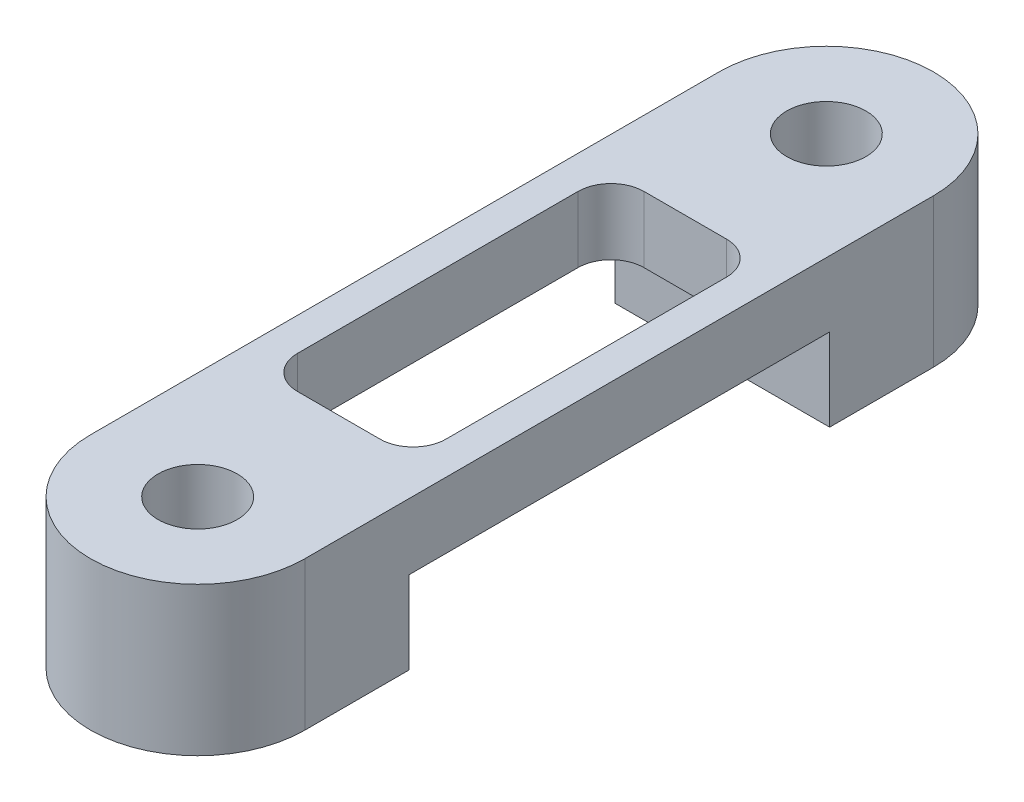
ISO-10303-21;
HEADER;
FILE_DESCRIPTION(('STEP AP214'),'2;1');
FILE_NAME('part.step','',(''),(''),'','','');
FILE_SCHEMA(('AUTOMOTIVE_DESIGN { 1 0 10303 214 1 1 1 1 }'));
ENDSEC;
DATA;
#1=APPLICATION_CONTEXT('core data for automotive mechanical design processes');
#2=APPLICATION_PROTOCOL_DEFINITION('international standard','automotive_design',2000,#1);
#3=PRODUCT_CONTEXT('',#1,'mechanical');
#4=PRODUCT('Part','Part','',(#3));
#5=PRODUCT_RELATED_PRODUCT_CATEGORY('part','',(#4));
#6=PRODUCT_DEFINITION_FORMATION('','',#4);
#7=PRODUCT_DEFINITION_CONTEXT('part definition',#1,'design');
#8=PRODUCT_DEFINITION('design','',#6,#7);
#9=PRODUCT_DEFINITION_SHAPE('','',#8);
#10=(LENGTH_UNIT() NAMED_UNIT(*) SI_UNIT(.MILLI.,.METRE.));
#11=(NAMED_UNIT(*) PLANE_ANGLE_UNIT() SI_UNIT($,.RADIAN.));
#12=(NAMED_UNIT(*) SI_UNIT($,.STERADIAN.) SOLID_ANGLE_UNIT());
#13=UNCERTAINTY_MEASURE_WITH_UNIT(LENGTH_MEASURE(1.E-05),#10,'distance_accuracy_value','');
#14=(GEOMETRIC_REPRESENTATION_CONTEXT(3) GLOBAL_UNCERTAINTY_ASSIGNED_CONTEXT((#13)) GLOBAL_UNIT_ASSIGNED_CONTEXT((#10,
#11,#12)) REPRESENTATION_CONTEXT('',''));
#15=CARTESIAN_POINT('',(0.,0.,0.));
#16=DIRECTION('',(0.,0.,1.));
#17=DIRECTION('',(1.,0.,0.));
#18=AXIS2_PLACEMENT_3D('',#15,#16,#17);
#19=CARTESIAN_POINT('',(0.,-4.5,-9.525));
#20=DIRECTION('',(0.,1.,0.));
#21=DIRECTION('',(0.,0.,1.));
#22=AXIS2_PLACEMENT_3D('',#19,#20,#21);
#23=PLANE('',#22);
#24=DIRECTION('',(-1.,0.,0.));
#25=VECTOR('',#24,1.);
#26=CARTESIAN_POINT('',(0.,-4.5,-6.375));
#27=LINE('',#26,#25);
#28=CARTESIAN_POINT('',(3.24999999999999,-4.5,-6.375));
#29=VERTEX_POINT('',#28);
#30=CARTESIAN_POINT('',(-3.24999999999999,-4.5,-6.375));
#31=VERTEX_POINT('',#30);
#32=EDGE_CURVE('E200',#29,#31,#27,.T.);
#33=ORIENTED_EDGE('',*,*,#32,.T.);
#34=DIRECTION('',(0.,0.,1.));
#35=VECTOR('',#34,1.);
#36=CARTESIAN_POINT('',(-3.24999999999999,-4.5,0.));
#37=LINE('',#36,#35);
#38=CARTESIAN_POINT('',(-3.24999999999999,-4.5,-9.525));
#39=VERTEX_POINT('',#38);
#40=EDGE_CURVE('E202',#39,#31,#37,.T.);
#41=ORIENTED_EDGE('',*,*,#40,.F.);
#42=CARTESIAN_POINT('',(0.,-4.5,-9.525));
#43=DIRECTION('',(0.,1.,0.));
#44=DIRECTION('',(0.,0.,1.));
#45=AXIS2_PLACEMENT_3D('',#42,#43,#44);
#46=CIRCLE('',#45,3.24999999999999);
#47=CARTESIAN_POINT('',(3.24999999999999,-4.5,-9.525));
#48=VERTEX_POINT('',#47);
#49=EDGE_CURVE('E205',#48,#39,#46,.T.);
#50=ORIENTED_EDGE('',*,*,#49,.F.);
#51=DIRECTION('',(0.,0.,1.));
#52=VECTOR('',#51,1.);
#53=CARTESIAN_POINT('',(3.24999999999999,-4.5,0.));
#54=LINE('',#53,#52);
#55=EDGE_CURVE('E208',#48,#29,#54,.T.);
#56=ORIENTED_EDGE('',*,*,#55,.T.);
#57=EDGE_LOOP('',(#33,#41,#50,#56));
#58=FACE_BOUND('',#57,.T.);
#59=CARTESIAN_POINT('',(0.,-4.5,-9.525));
#60=DIRECTION('',(0.,-1.,0.));
#61=DIRECTION('',(0.,0.,-1.));
#62=AXIS2_PLACEMENT_3D('',#59,#60,#61);
#63=CIRCLE('',#62,1.2);
#64=CARTESIAN_POINT('',(0.,-4.5,-10.725));
#65=VERTEX_POINT('',#64);
#66=EDGE_CURVE('E397',#65,#65,#63,.T.);
#67=ORIENTED_EDGE('',*,*,#66,.F.);
#68=EDGE_LOOP('',(#67));
#69=FACE_BOUND('',#68,.T.);
#70=ADVANCED_FACE('F47',(#58,#69),#23,.F.);
#71=CARTESIAN_POINT('',(0.,-2.,0.));
#72=DIRECTION('',(0.,1.,0.));
#73=DIRECTION('',(0.,0.,1.));
#74=AXIS2_PLACEMENT_3D('',#71,#72,#73);
#75=PLANE('',#74);
#76=DIRECTION('',(-1.,0.,0.));
#77=VECTOR('',#76,1.);
#78=CARTESIAN_POINT('',(0.,-2.,-5.25));
#79=LINE('',#78,#77);
#80=CARTESIAN_POINT('',(1.24999999999999,-2.,-5.25));
#81=VERTEX_POINT('',#80);
#82=CARTESIAN_POINT('',(-1.24999999999999,-2.,-5.25));
#83=VERTEX_POINT('',#82);
#84=EDGE_CURVE('E222',#81,#83,#79,.T.);
#85=ORIENTED_EDGE('',*,*,#84,.T.);
#86=CARTESIAN_POINT('',(-1.24999999999999,-2.,-4.25));
#87=DIRECTION('',(0.,1.,0.));
#88=DIRECTION('',(0.,0.,1.));
#89=AXIS2_PLACEMENT_3D('',#86,#87,#88);
#90=CIRCLE('',#89,1.);
#91=CARTESIAN_POINT('',(-2.24999999999999,-2.,-4.25));
#92=VERTEX_POINT('',#91);
#93=EDGE_CURVE('E13',#83,#92,#90,.T.);
#94=ORIENTED_EDGE('',*,*,#93,.T.);
#95=DIRECTION('',(0.,0.,1.));
#96=VECTOR('',#95,1.);
#97=CARTESIAN_POINT('',(-2.24999999999999,-2.,0.));
#98=LINE('',#97,#96);
#99=CARTESIAN_POINT('',(-2.24999999999999,-2.,4.25));
#100=VERTEX_POINT('',#99);
#101=EDGE_CURVE('E219',#92,#100,#98,.T.);
#102=ORIENTED_EDGE('',*,*,#101,.T.);
#103=CARTESIAN_POINT('',(-1.24999999999999,-2.,4.25));
#104=DIRECTION('',(0.,1.,0.));
#105=DIRECTION('',(0.,0.,1.));
#106=AXIS2_PLACEMENT_3D('',#103,#104,#105);
#107=CIRCLE('',#106,1.);
#108=CARTESIAN_POINT('',(-1.24999999999999,-2.,5.25));
#109=VERTEX_POINT('',#108);
#110=EDGE_CURVE('E280',#100,#109,#107,.T.);
#111=ORIENTED_EDGE('',*,*,#110,.T.);
#112=DIRECTION('',(-1.,0.,0.));
#113=VECTOR('',#112,1.);
#114=CARTESIAN_POINT('',(0.,-2.,5.25));
#115=LINE('',#114,#113);
#116=CARTESIAN_POINT('',(1.24999999999999,-2.,5.25));
#117=VERTEX_POINT('',#116);
#118=EDGE_CURVE('E228',#117,#109,#115,.T.);
#119=ORIENTED_EDGE('',*,*,#118,.F.);
#120=CARTESIAN_POINT('',(1.24999999999999,-2.,4.25));
#121=DIRECTION('',(0.,1.,0.));
#122=DIRECTION('',(0.,0.,1.));
#123=AXIS2_PLACEMENT_3D('',#120,#121,#122);
#124=CIRCLE('',#123,1.);
#125=CARTESIAN_POINT('',(2.24999999999999,-2.,4.25));
#126=VERTEX_POINT('',#125);
#127=EDGE_CURVE('E284',#117,#126,#124,.T.);
#128=ORIENTED_EDGE('',*,*,#127,.T.);
#129=DIRECTION('',(0.,0.,1.));
#130=VECTOR('',#129,1.);
#131=CARTESIAN_POINT('',(2.24999999999999,-2.,0.));
#132=LINE('',#131,#130);
#133=CARTESIAN_POINT('',(2.24999999999999,-2.,-4.25));
#134=VERTEX_POINT('',#133);
#135=EDGE_CURVE('E225',#134,#126,#132,.T.);
#136=ORIENTED_EDGE('',*,*,#135,.F.);
#137=CARTESIAN_POINT('',(1.24999999999999,-2.,-4.25));
#138=DIRECTION('',(0.,1.,0.));
#139=DIRECTION('',(0.,0.,1.));
#140=AXIS2_PLACEMENT_3D('',#137,#138,#139);
#141=CIRCLE('',#140,1.);
#142=EDGE_CURVE('E69',#134,#81,#141,.T.);
#143=ORIENTED_EDGE('',*,*,#142,.T.);
#144=EDGE_LOOP('',(#85,#94,#102,#111,#119,#128,#136,#143));
#145=FACE_BOUND('',#144,.T.);
#146=DIRECTION('',(0.,0.,1.));
#147=VECTOR('',#146,1.);
#148=CARTESIAN_POINT('',(3.24999999999999,-2.,0.));
#149=LINE('',#148,#147);
#150=CARTESIAN_POINT('',(3.24999999999999,-2.,-6.375));
#151=VERTEX_POINT('',#150);
#152=CARTESIAN_POINT('',(3.24999999999999,-2.,6.375));
#153=VERTEX_POINT('',#152);
#154=EDGE_CURVE('E231',#151,#153,#149,.T.);
#155=ORIENTED_EDGE('',*,*,#154,.T.);
#156=DIRECTION('',(-1.,0.,0.));
#157=VECTOR('',#156,1.);
#158=CARTESIAN_POINT('',(0.,-2.,6.375));
#159=LINE('',#158,#157);
#160=CARTESIAN_POINT('',(-3.24999999999999,-2.,6.375));
#161=VERTEX_POINT('',#160);
#162=EDGE_CURVE('E183',#153,#161,#159,.T.);
#163=ORIENTED_EDGE('',*,*,#162,.T.);
#164=DIRECTION('',(0.,0.,1.));
#165=VECTOR('',#164,1.);
#166=CARTESIAN_POINT('',(-3.24999999999999,-2.,0.));
#167=LINE('',#166,#165);
#168=CARTESIAN_POINT('',(-3.24999999999999,-2.,-6.375));
#169=VERTEX_POINT('',#168);
#170=EDGE_CURVE('E234',#169,#161,#167,.T.);
#171=ORIENTED_EDGE('',*,*,#170,.F.);
#172=DIRECTION('',(-1.,0.,0.));
#173=VECTOR('',#172,1.);
#174=CARTESIAN_POINT('',(0.,-2.,-6.375));
#175=LINE('',#174,#173);
#176=EDGE_CURVE('E199',#151,#169,#175,.T.);
#177=ORIENTED_EDGE('',*,*,#176,.F.);
#178=EDGE_LOOP('',(#155,#163,#171,#177));
#179=FACE_BOUND('',#178,.T.);
#180=ADVANCED_FACE('F299',(#145,#179),#75,.F.);
#181=CARTESIAN_POINT('',(3.24999999999999,-2.,0.));
#182=DIRECTION('',(-1.,0.,0.));
#183=DIRECTION('',(0.,0.,1.));
#184=AXIS2_PLACEMENT_3D('',#181,#182,#183);
#185=PLANE('',#184);
#186=DIRECTION('',(0.,0.,1.));
#187=VECTOR('',#186,1.);
#188=CARTESIAN_POINT('',(3.24999999999999,0.,0.));
#189=LINE('',#188,#187);
#190=CARTESIAN_POINT('',(3.24999999999999,0.,-9.525));
#191=VERTEX_POINT('',#190);
#192=CARTESIAN_POINT('',(3.24999999999999,0.,9.525));
#193=VERTEX_POINT('',#192);
#194=EDGE_CURVE('E167',#191,#193,#189,.T.);
#195=ORIENTED_EDGE('',*,*,#194,.T.);
#196=DIRECTION('',(0.,1.,0.));
#197=VECTOR('',#196,1.);
#198=CARTESIAN_POINT('',(3.24999999999999,-2.,9.525));
#199=LINE('',#198,#197);
#200=CARTESIAN_POINT('',(3.24999999999999,-4.5,9.525));
#201=VERTEX_POINT('',#200);
#202=EDGE_CURVE('E161',#201,#193,#199,.T.);
#203=ORIENTED_EDGE('',*,*,#202,.F.);
#204=DIRECTION('',(0.,0.,1.));
#205=VECTOR('',#204,1.);
#206=CARTESIAN_POINT('',(3.24999999999999,-4.5,0.));
#207=LINE('',#206,#205);
#208=CARTESIAN_POINT('',(3.24999999999999,-4.5,6.375));
#209=VERTEX_POINT('',#208);
#210=EDGE_CURVE('E164',#209,#201,#207,.T.);
#211=ORIENTED_EDGE('',*,*,#210,.F.);
#212=DIRECTION('',(0.,1.,0.));
#213=VECTOR('',#212,1.);
#214=CARTESIAN_POINT('',(3.24999999999999,-4.5,6.375));
#215=LINE('',#214,#213);
#216=EDGE_CURVE('E192',#209,#153,#215,.T.);
#217=ORIENTED_EDGE('',*,*,#216,.T.);
#218=ORIENTED_EDGE('',*,*,#154,.F.);
#219=DIRECTION('',(0.,1.,0.));
#220=VECTOR('',#219,1.);
#221=CARTESIAN_POINT('',(3.24999999999999,-4.5,-6.375));
#222=LINE('',#221,#220);
#223=EDGE_CURVE('E210',#29,#151,#222,.T.);
#224=ORIENTED_EDGE('',*,*,#223,.F.);
#225=ORIENTED_EDGE('',*,*,#55,.F.);
#226=DIRECTION('',(0.,1.,0.));
#227=VECTOR('',#226,1.);
#228=CARTESIAN_POINT('',(3.24999999999999,-2.,-9.525));
#229=LINE('',#228,#227);
#230=EDGE_CURVE('E237',#48,#191,#229,.T.);
#231=ORIENTED_EDGE('',*,*,#230,.T.);
#232=EDGE_LOOP('',(#195,#203,#211,#217,#218,#224,#225,#231));
#233=FACE_BOUND('',#232,.T.);
#234=ADVANCED_FACE('F163',(#233),#185,.F.);
#235=CARTESIAN_POINT('',(0.,-2.,9.525));
#236=DIRECTION('',(0.,1.,0.));
#237=DIRECTION('',(0.,0.,1.));
#238=AXIS2_PLACEMENT_3D('',#235,#236,#237);
#239=CYLINDRICAL_SURFACE('',#238,3.24999999999999);
#240=CARTESIAN_POINT('',(0.,0.,9.525));
#241=DIRECTION('',(0.,1.,0.));
#242=DIRECTION('',(0.,0.,1.));
#243=AXIS2_PLACEMENT_3D('',#240,#241,#242);
#244=CIRCLE('',#243,3.24999999999999);
#245=CARTESIAN_POINT('',(-3.24999999999999,0.,9.525));
#246=VERTEX_POINT('',#245);
#247=EDGE_CURVE('E223',#246,#193,#244,.T.);
#248=ORIENTED_EDGE('',*,*,#247,.F.);
#249=DIRECTION('',(0.,1.,0.));
#250=VECTOR('',#249,1.);
#251=CARTESIAN_POINT('',(-3.24999999999999,-2.,9.525));
#252=LINE('',#251,#250);
#253=CARTESIAN_POINT('',(-3.24999999999999,-4.5,9.525));
#254=VERTEX_POINT('',#253);
#255=EDGE_CURVE('E173',#254,#246,#252,.T.);
#256=ORIENTED_EDGE('',*,*,#255,.F.);
#257=CARTESIAN_POINT('',(0.,-4.5,9.525));
#258=DIRECTION('',(0.,1.,0.));
#259=DIRECTION('',(0.,0.,1.));
#260=AXIS2_PLACEMENT_3D('',#257,#258,#259);
#261=CIRCLE('',#260,3.24999999999999);
#262=EDGE_CURVE('E179',#254,#201,#261,.T.);
#263=ORIENTED_EDGE('',*,*,#262,.T.);
#264=ORIENTED_EDGE('',*,*,#202,.T.);
#265=EDGE_LOOP('',(#248,#256,#263,#264));
#266=FACE_BOUND('',#265,.T.);
#267=ADVANCED_FACE('F185',(#266),#239,.T.);
#268=CARTESIAN_POINT('',(-3.24999999999999,-2.,0.));
#269=DIRECTION('',(-1.,0.,0.));
#270=DIRECTION('',(0.,0.,1.));
#271=AXIS2_PLACEMENT_3D('',#268,#269,#270);
#272=PLANE('',#271);
#273=DIRECTION('',(0.,0.,1.));
#274=VECTOR('',#273,1.);
#275=CARTESIAN_POINT('',(-3.24999999999999,0.,0.));
#276=LINE('',#275,#274);
#277=CARTESIAN_POINT('',(-3.24999999999999,0.,-9.525));
#278=VERTEX_POINT('',#277);
#279=EDGE_CURVE('E252',#278,#246,#276,.T.);
#280=ORIENTED_EDGE('',*,*,#279,.F.);
#281=DIRECTION('',(0.,1.,0.));
#282=VECTOR('',#281,1.);
#283=CARTESIAN_POINT('',(-3.24999999999999,-2.,-9.525));
#284=LINE('',#283,#282);
#285=EDGE_CURVE('E257',#39,#278,#284,.T.);
#286=ORIENTED_EDGE('',*,*,#285,.F.);
#287=ORIENTED_EDGE('',*,*,#40,.T.);
#288=DIRECTION('',(0.,1.,0.));
#289=VECTOR('',#288,1.);
#290=CARTESIAN_POINT('',(-3.24999999999999,-4.5,-6.375));
#291=LINE('',#290,#289);
#292=EDGE_CURVE('E215',#31,#169,#291,.T.);
#293=ORIENTED_EDGE('',*,*,#292,.T.);
#294=ORIENTED_EDGE('',*,*,#170,.T.);
#295=DIRECTION('',(0.,1.,0.));
#296=VECTOR('',#295,1.);
#297=CARTESIAN_POINT('',(-3.24999999999999,-4.5,6.375));
#298=LINE('',#297,#296);
#299=CARTESIAN_POINT('',(-3.24999999999999,-4.5,6.375));
#300=VERTEX_POINT('',#299);
#301=EDGE_CURVE('E197',#300,#161,#298,.T.);
#302=ORIENTED_EDGE('',*,*,#301,.F.);
#303=DIRECTION('',(0.,0.,1.));
#304=VECTOR('',#303,1.);
#305=CARTESIAN_POINT('',(-3.24999999999999,-4.5,0.));
#306=LINE('',#305,#304);
#307=EDGE_CURVE('E186',#300,#254,#306,.T.);
#308=ORIENTED_EDGE('',*,*,#307,.T.);
#309=ORIENTED_EDGE('',*,*,#255,.T.);
#310=EDGE_LOOP('',(#280,#286,#287,#293,#294,#302,#308,#309));
#311=FACE_BOUND('',#310,.T.);
#312=ADVANCED_FACE('F351',(#311),#272,.T.);
#313=CARTESIAN_POINT('',(-2.24999999999999,-2.,0.));
#314=DIRECTION('',(-1.,0.,0.));
#315=DIRECTION('',(0.,0.,1.));
#316=AXIS2_PLACEMENT_3D('',#313,#314,#315);
#317=PLANE('',#316);
#318=DIRECTION('',(0.,0.,1.));
#319=VECTOR('',#318,1.);
#320=CARTESIAN_POINT('',(-2.24999999999999,0.,0.));
#321=LINE('',#320,#319);
#322=CARTESIAN_POINT('',(-2.24999999999999,0.,-4.25));
#323=VERTEX_POINT('',#322);
#324=CARTESIAN_POINT('',(-2.24999999999999,0.,4.25));
#325=VERTEX_POINT('',#324);
#326=EDGE_CURVE('E218',#323,#325,#321,.T.);
#327=ORIENTED_EDGE('',*,*,#326,.T.);
#328=DIRECTION('',(0.,1.,0.));
#329=VECTOR('',#328,1.);
#330=CARTESIAN_POINT('',(-2.24999999999999,-2.,4.25));
#331=LINE('',#330,#329);
#332=EDGE_CURVE('E267',#325,#100,#331,.F.);
#333=ORIENTED_EDGE('',*,*,#332,.T.);
#334=ORIENTED_EDGE('',*,*,#101,.F.);
#335=DIRECTION('',(0.,1.,0.));
#336=VECTOR('',#335,1.);
#337=CARTESIAN_POINT('',(-2.24999999999999,0.,-4.25));
#338=LINE('',#337,#336);
#339=EDGE_CURVE('E264',#92,#323,#338,.T.);
#340=ORIENTED_EDGE('',*,*,#339,.T.);
#341=EDGE_LOOP('',(#327,#333,#334,#340));
#342=FACE_BOUND('',#341,.T.);
#343=ADVANCED_FACE('F303',(#342),#317,.F.);
#344=CARTESIAN_POINT('',(0.,-2.,5.25));
#345=DIRECTION('',(0.,0.,-1.));
#346=DIRECTION('',(-1.,0.,0.));
#347=AXIS2_PLACEMENT_3D('',#344,#345,#346);
#348=PLANE('',#347);
#349=ORIENTED_EDGE('',*,*,#118,.T.);
#350=DIRECTION('',(0.,1.,0.));
#351=VECTOR('',#350,1.);
#352=CARTESIAN_POINT('',(-1.24999999999999,-2.,5.25));
#353=LINE('',#352,#351);
#354=CARTESIAN_POINT('',(-1.24999999999999,0.,5.25));
#355=VERTEX_POINT('',#354);
#356=EDGE_CURVE('E261',#109,#355,#353,.T.);
#357=ORIENTED_EDGE('',*,*,#356,.T.);
#358=DIRECTION('',(-1.,0.,0.));
#359=VECTOR('',#358,1.);
#360=CARTESIAN_POINT('',(0.,0.,5.25));
#361=LINE('',#360,#359);
#362=CARTESIAN_POINT('',(1.24999999999999,0.,5.25));
#363=VERTEX_POINT('',#362);
#364=EDGE_CURVE('E245',#363,#355,#361,.T.);
#365=ORIENTED_EDGE('',*,*,#364,.F.);
#366=DIRECTION('',(0.,1.,0.));
#367=VECTOR('',#366,1.);
#368=CARTESIAN_POINT('',(1.24999999999999,-2.,5.25));
#369=LINE('',#368,#367);
#370=EDGE_CURVE('E172',#363,#117,#369,.F.);
#371=ORIENTED_EDGE('',*,*,#370,.T.);
#372=EDGE_LOOP('',(#349,#357,#365,#371));
#373=FACE_BOUND('',#372,.T.);
#374=ADVANCED_FACE('F311',(#373),#348,.T.);
#375=CARTESIAN_POINT('',(2.24999999999999,-2.,0.));
#376=DIRECTION('',(-1.,0.,0.));
#377=DIRECTION('',(0.,0.,1.));
#378=AXIS2_PLACEMENT_3D('',#375,#376,#377);
#379=PLANE('',#378);
#380=ORIENTED_EDGE('',*,*,#135,.T.);
#381=DIRECTION('',(0.,1.,0.));
#382=VECTOR('',#381,1.);
#383=CARTESIAN_POINT('',(2.24999999999999,0.,4.25));
#384=LINE('',#383,#382);
#385=CARTESIAN_POINT('',(2.24999999999999,0.,4.25));
#386=VERTEX_POINT('',#385);
#387=EDGE_CURVE('E271',#126,#386,#384,.T.);
#388=ORIENTED_EDGE('',*,*,#387,.T.);
#389=DIRECTION('',(0.,0.,1.));
#390=VECTOR('',#389,1.);
#391=CARTESIAN_POINT('',(2.24999999999999,0.,0.));
#392=LINE('',#391,#390);
#393=CARTESIAN_POINT('',(2.24999999999999,0.,-4.25));
#394=VERTEX_POINT('',#393);
#395=EDGE_CURVE('E242',#394,#386,#392,.T.);
#396=ORIENTED_EDGE('',*,*,#395,.F.);
#397=DIRECTION('',(0.,1.,0.));
#398=VECTOR('',#397,1.);
#399=CARTESIAN_POINT('',(2.24999999999999,-2.,-4.25));
#400=LINE('',#399,#398);
#401=EDGE_CURVE('E269',#394,#134,#400,.F.);
#402=ORIENTED_EDGE('',*,*,#401,.T.);
#403=EDGE_LOOP('',(#380,#388,#396,#402));
#404=FACE_BOUND('',#403,.T.);
#405=ADVANCED_FACE('F318',(#404),#379,.T.);
#406=CARTESIAN_POINT('',(0.,-2.,-5.25));
#407=DIRECTION('',(0.,0.,-1.));
#408=DIRECTION('',(-1.,0.,0.));
#409=AXIS2_PLACEMENT_3D('',#406,#407,#408);
#410=PLANE('',#409);
#411=ORIENTED_EDGE('',*,*,#84,.F.);
#412=DIRECTION('',(0.,1.,0.));
#413=VECTOR('',#412,1.);
#414=CARTESIAN_POINT('',(1.24999999999999,-2.,-5.25));
#415=LINE('',#414,#413);
#416=CARTESIAN_POINT('',(1.24999999999999,0.,-5.25));
#417=VERTEX_POINT('',#416);
#418=EDGE_CURVE('E275',#81,#417,#415,.T.);
#419=ORIENTED_EDGE('',*,*,#418,.T.);
#420=DIRECTION('',(-1.,0.,0.));
#421=VECTOR('',#420,1.);
#422=CARTESIAN_POINT('',(0.,0.,-5.25));
#423=LINE('',#422,#421);
#424=CARTESIAN_POINT('',(-1.24999999999999,0.,-5.25));
#425=VERTEX_POINT('',#424);
#426=EDGE_CURVE('E240',#417,#425,#423,.T.);
#427=ORIENTED_EDGE('',*,*,#426,.T.);
#428=DIRECTION('',(0.,1.,0.));
#429=VECTOR('',#428,1.);
#430=CARTESIAN_POINT('',(-1.24999999999999,-2.,-5.25));
#431=LINE('',#430,#429);
#432=EDGE_CURVE('E62',#425,#83,#431,.F.);
#433=ORIENTED_EDGE('',*,*,#432,.T.);
#434=EDGE_LOOP('',(#411,#419,#427,#433));
#435=FACE_BOUND('',#434,.T.);
#436=ADVANCED_FACE('F295',(#435),#410,.F.);
#437=CARTESIAN_POINT('',(0.,-2.,-9.525));
#438=DIRECTION('',(0.,1.,0.));
#439=DIRECTION('',(0.,0.,1.));
#440=AXIS2_PLACEMENT_3D('',#437,#438,#439);
#441=CYLINDRICAL_SURFACE('',#440,3.24999999999999);
#442=CARTESIAN_POINT('',(0.,0.,-9.525));
#443=DIRECTION('',(0.,1.,0.));
#444=DIRECTION('',(0.,0.,1.));
#445=AXIS2_PLACEMENT_3D('',#442,#443,#444);
#446=CIRCLE('',#445,3.24999999999999);
#447=EDGE_CURVE('E249',#191,#278,#446,.T.);
#448=ORIENTED_EDGE('',*,*,#447,.F.);
#449=ORIENTED_EDGE('',*,*,#230,.F.);
#450=ORIENTED_EDGE('',*,*,#49,.T.);
#451=ORIENTED_EDGE('',*,*,#285,.T.);
#452=EDGE_LOOP('',(#448,#449,#450,#451));
#453=FACE_BOUND('',#452,.T.);
#454=ADVANCED_FACE('F347',(#453),#441,.T.);
#455=CARTESIAN_POINT('',(0.,0.,0.));
#456=DIRECTION('',(0.,1.,0.));
#457=DIRECTION('',(0.,0.,1.));
#458=AXIS2_PLACEMENT_3D('',#455,#456,#457);
#459=PLANE('',#458);
#460=CARTESIAN_POINT('',(0.,0.,-9.525));
#461=DIRECTION('',(0.,-1.,0.));
#462=DIRECTION('',(0.,0.,-1.));
#463=AXIS2_PLACEMENT_3D('',#460,#461,#462);
#464=CIRCLE('',#463,1.2);
#465=CARTESIAN_POINT('',(0.,0.,-10.725));
#466=VERTEX_POINT('',#465);
#467=EDGE_CURVE('E393',#466,#466,#464,.T.);
#468=ORIENTED_EDGE('',*,*,#467,.T.);
#469=EDGE_LOOP('',(#468));
#470=FACE_BOUND('',#469,.T.);
#471=CARTESIAN_POINT('',(0.,0.,9.525));
#472=DIRECTION('',(0.,-1.,0.));
#473=DIRECTION('',(0.,0.,-1.));
#474=AXIS2_PLACEMENT_3D('',#471,#472,#473);
#475=CIRCLE('',#474,1.2);
#476=CARTESIAN_POINT('',(0.,0.,8.325));
#477=VERTEX_POINT('',#476);
#478=EDGE_CURVE('E195',#477,#477,#475,.T.);
#479=ORIENTED_EDGE('',*,*,#478,.T.);
#480=EDGE_LOOP('',(#479));
#481=FACE_BOUND('',#480,.T.);
#482=ORIENTED_EDGE('',*,*,#326,.F.);
#483=CARTESIAN_POINT('',(-1.24999999999999,0.,-4.25));
#484=DIRECTION('',(0.,1.,0.));
#485=DIRECTION('',(0.,0.,1.));
#486=AXIS2_PLACEMENT_3D('',#483,#484,#485);
#487=CIRCLE('',#486,1.);
#488=EDGE_CURVE('E55',#323,#425,#487,.F.);
#489=ORIENTED_EDGE('',*,*,#488,.T.);
#490=ORIENTED_EDGE('',*,*,#426,.F.);
#491=CARTESIAN_POINT('',(1.24999999999999,0.,-4.25));
#492=DIRECTION('',(0.,1.,0.));
#493=DIRECTION('',(0.,0.,1.));
#494=AXIS2_PLACEMENT_3D('',#491,#492,#493);
#495=CIRCLE('',#494,1.);
#496=EDGE_CURVE('E286',#417,#394,#495,.F.);
#497=ORIENTED_EDGE('',*,*,#496,.T.);
#498=ORIENTED_EDGE('',*,*,#395,.T.);
#499=CARTESIAN_POINT('',(1.24999999999999,0.,4.25));
#500=DIRECTION('',(0.,1.,0.));
#501=DIRECTION('',(0.,0.,1.));
#502=AXIS2_PLACEMENT_3D('',#499,#500,#501);
#503=CIRCLE('',#502,1.);
#504=EDGE_CURVE('E282',#386,#363,#503,.F.);
#505=ORIENTED_EDGE('',*,*,#504,.T.);
#506=ORIENTED_EDGE('',*,*,#364,.T.);
#507=CARTESIAN_POINT('',(-1.24999999999999,0.,4.25));
#508=DIRECTION('',(0.,1.,0.));
#509=DIRECTION('',(0.,0.,1.));
#510=AXIS2_PLACEMENT_3D('',#507,#508,#509);
#511=CIRCLE('',#510,1.);
#512=EDGE_CURVE('E278',#355,#325,#511,.F.);
#513=ORIENTED_EDGE('',*,*,#512,.T.);
#514=EDGE_LOOP('',(#482,#489,#490,#497,#498,#505,#506,#513));
#515=FACE_BOUND('',#514,.T.);
#516=ORIENTED_EDGE('',*,*,#194,.F.);
#517=ORIENTED_EDGE('',*,*,#447,.T.);
#518=ORIENTED_EDGE('',*,*,#279,.T.);
#519=ORIENTED_EDGE('',*,*,#247,.T.);
#520=EDGE_LOOP('',(#516,#517,#518,#519));
#521=FACE_BOUND('',#520,.T.);
#522=ADVANCED_FACE('F291',(#470,#481,#515,#521),#459,.T.);
#523=CARTESIAN_POINT('',(0.,-4.5,-6.375));
#524=DIRECTION('',(0.,0.,-1.));
#525=DIRECTION('',(-1.,0.,0.));
#526=AXIS2_PLACEMENT_3D('',#523,#524,#525);
#527=PLANE('',#526);
#528=ORIENTED_EDGE('',*,*,#176,.T.);
#529=ORIENTED_EDGE('',*,*,#292,.F.);
#530=ORIENTED_EDGE('',*,*,#32,.F.);
#531=ORIENTED_EDGE('',*,*,#223,.T.);
#532=EDGE_LOOP('',(#528,#529,#530,#531));
#533=FACE_BOUND('',#532,.T.);
#534=ADVANCED_FACE('F341',(#533),#527,.F.);
#535=CARTESIAN_POINT('',(0.,-4.5,6.375));
#536=DIRECTION('',(0.,0.,-1.));
#537=DIRECTION('',(-1.,0.,0.));
#538=AXIS2_PLACEMENT_3D('',#535,#536,#537);
#539=PLANE('',#538);
#540=ORIENTED_EDGE('',*,*,#162,.F.);
#541=ORIENTED_EDGE('',*,*,#216,.F.);
#542=DIRECTION('',(-1.,0.,0.));
#543=VECTOR('',#542,1.);
#544=CARTESIAN_POINT('',(0.,-4.5,6.375));
#545=LINE('',#544,#543);
#546=EDGE_CURVE('E182',#209,#300,#545,.T.);
#547=ORIENTED_EDGE('',*,*,#546,.T.);
#548=ORIENTED_EDGE('',*,*,#301,.T.);
#549=EDGE_LOOP('',(#540,#541,#547,#548));
#550=FACE_BOUND('',#549,.T.);
#551=ADVANCED_FACE('F339',(#550),#539,.T.);
#552=CARTESIAN_POINT('',(0.,-4.5,9.525));
#553=DIRECTION('',(0.,1.,0.));
#554=DIRECTION('',(0.,0.,1.));
#555=AXIS2_PLACEMENT_3D('',#552,#553,#554);
#556=PLANE('',#555);
#557=CARTESIAN_POINT('',(0.,-4.5,9.525));
#558=DIRECTION('',(0.,-1.,0.));
#559=DIRECTION('',(0.,0.,-1.));
#560=AXIS2_PLACEMENT_3D('',#557,#558,#559);
#561=CIRCLE('',#560,1.2);
#562=CARTESIAN_POINT('',(0.,-4.5,8.325));
#563=VERTEX_POINT('',#562);
#564=EDGE_CURVE('E391',#563,#563,#561,.T.);
#565=ORIENTED_EDGE('',*,*,#564,.F.);
#566=EDGE_LOOP('',(#565));
#567=FACE_BOUND('',#566,.T.);
#568=ORIENTED_EDGE('',*,*,#210,.T.);
#569=ORIENTED_EDGE('',*,*,#262,.F.);
#570=ORIENTED_EDGE('',*,*,#307,.F.);
#571=ORIENTED_EDGE('',*,*,#546,.F.);
#572=EDGE_LOOP('',(#568,#569,#570,#571));
#573=FACE_BOUND('',#572,.T.);
#574=ADVANCED_FACE('F177',(#567,#573),#556,.F.);
#575=CARTESIAN_POINT('',(0.,-4.5,9.525));
#576=DIRECTION('',(0.,-1.,0.));
#577=DIRECTION('',(0.,0.,-1.));
#578=AXIS2_PLACEMENT_3D('',#575,#576,#577);
#579=CYLINDRICAL_SURFACE('',#578,1.2);
#580=ORIENTED_EDGE('',*,*,#478,.F.);
#581=EDGE_LOOP('',(#580));
#582=FACE_BOUND('',#581,.T.);
#583=ORIENTED_EDGE('',*,*,#564,.T.);
#584=EDGE_LOOP('',(#583));
#585=FACE_BOUND('',#584,.T.);
#586=ADVANCED_FACE('F373',(#582,#585),#579,.F.);
#587=CARTESIAN_POINT('',(0.,-4.5,-9.525));
#588=DIRECTION('',(0.,-1.,0.));
#589=DIRECTION('',(0.,0.,-1.));
#590=AXIS2_PLACEMENT_3D('',#587,#588,#589);
#591=CYLINDRICAL_SURFACE('',#590,1.2);
#592=ORIENTED_EDGE('',*,*,#467,.F.);
#593=EDGE_LOOP('',(#592));
#594=FACE_BOUND('',#593,.T.);
#595=ORIENTED_EDGE('',*,*,#66,.T.);
#596=EDGE_LOOP('',(#595));
#597=FACE_BOUND('',#596,.T.);
#598=ADVANCED_FACE('F369',(#594,#597),#591,.F.);
#599=CARTESIAN_POINT('',(-1.24999999999999,-2.,4.25));
#600=DIRECTION('',(0.,1.,0.));
#601=DIRECTION('',(0.,0.,1.));
#602=AXIS2_PLACEMENT_3D('',#599,#600,#601);
#603=CYLINDRICAL_SURFACE('',#602,1.);
#604=ORIENTED_EDGE('',*,*,#110,.F.);
#605=ORIENTED_EDGE('',*,*,#332,.F.);
#606=ORIENTED_EDGE('',*,*,#512,.F.);
#607=ORIENTED_EDGE('',*,*,#356,.F.);
#608=EDGE_LOOP('',(#604,#605,#606,#607));
#609=FACE_BOUND('',#608,.T.);
#610=ADVANCED_FACE('F306',(#609),#603,.F.);
#611=CARTESIAN_POINT('',(1.24999999999999,-2.,4.25));
#612=DIRECTION('',(0.,-1.,0.));
#613=DIRECTION('',(0.,0.,-1.));
#614=AXIS2_PLACEMENT_3D('',#611,#612,#613);
#615=CYLINDRICAL_SURFACE('',#614,1.);
#616=ORIENTED_EDGE('',*,*,#127,.F.);
#617=ORIENTED_EDGE('',*,*,#370,.F.);
#618=ORIENTED_EDGE('',*,*,#504,.F.);
#619=ORIENTED_EDGE('',*,*,#387,.F.);
#620=EDGE_LOOP('',(#616,#617,#618,#619));
#621=FACE_BOUND('',#620,.T.);
#622=ADVANCED_FACE('F315',(#621),#615,.F.);
#623=CARTESIAN_POINT('',(1.24999999999999,-2.,-4.25));
#624=DIRECTION('',(0.,1.,0.));
#625=DIRECTION('',(0.,0.,1.));
#626=AXIS2_PLACEMENT_3D('',#623,#624,#625);
#627=CYLINDRICAL_SURFACE('',#626,1.);
#628=ORIENTED_EDGE('',*,*,#142,.F.);
#629=ORIENTED_EDGE('',*,*,#401,.F.);
#630=ORIENTED_EDGE('',*,*,#496,.F.);
#631=ORIENTED_EDGE('',*,*,#418,.F.);
#632=EDGE_LOOP('',(#628,#629,#630,#631));
#633=FACE_BOUND('',#632,.T.);
#634=ADVANCED_FACE('F322',(#633),#627,.F.);
#635=CARTESIAN_POINT('',(-1.24999999999999,-2.,-4.25));
#636=DIRECTION('',(0.,-1.,0.));
#637=DIRECTION('',(0.,0.,-1.));
#638=AXIS2_PLACEMENT_3D('',#635,#636,#637);
#639=CYLINDRICAL_SURFACE('',#638,1.);
#640=ORIENTED_EDGE('',*,*,#93,.F.);
#641=ORIENTED_EDGE('',*,*,#432,.F.);
#642=ORIENTED_EDGE('',*,*,#488,.F.);
#643=ORIENTED_EDGE('',*,*,#339,.F.);
#644=EDGE_LOOP('',(#640,#641,#642,#643));
#645=FACE_BOUND('',#644,.T.);
#646=ADVANCED_FACE('F49',(#645),#639,.F.);
#647=CLOSED_SHELL('',(#70,#180,#234,#267,#312,#343,#374,#405,#436,#454,#522,#534,#551,#574,#586,
#598,#610,#622,#634,#646));
#648=MANIFOLD_SOLID_BREP('B2',#647);
#649=ADVANCED_BREP_SHAPE_REPRESENTATION('',(#18,#648),#14);
#650=SHAPE_DEFINITION_REPRESENTATION(#9,#649);
ENDSEC;
END-ISO-10303-21;
